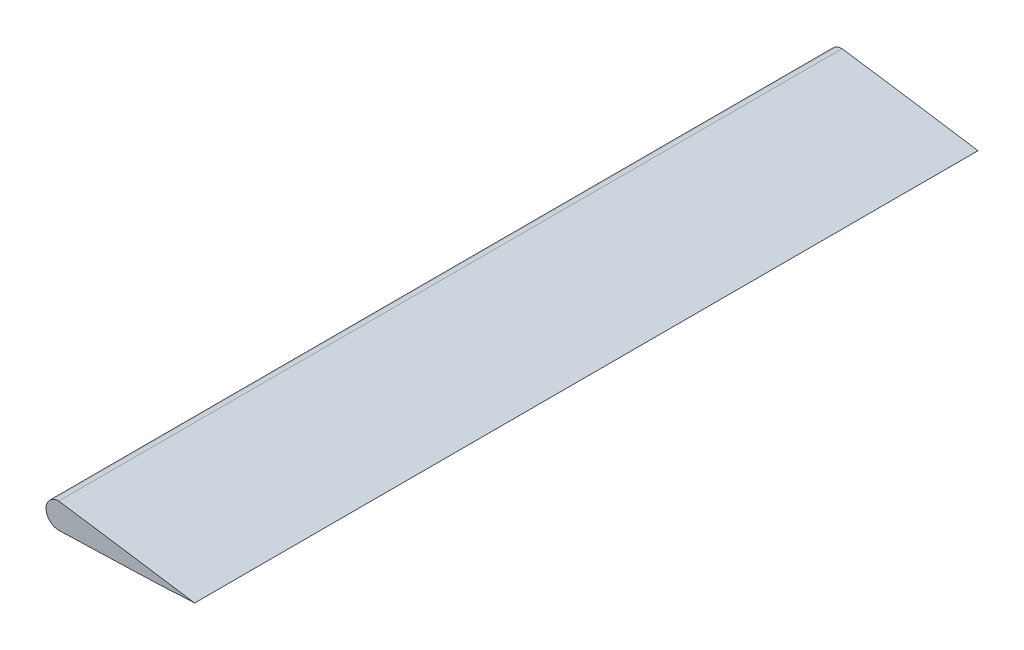
ISO-10303-21;
HEADER;
FILE_DESCRIPTION(('STEP AP214'),'2;1');
FILE_NAME('part.step','',(''),(''),'','','');
FILE_SCHEMA(('AUTOMOTIVE_DESIGN { 1 0 10303 214 1 1 1 1 }'));
ENDSEC;
DATA;
#1=APPLICATION_CONTEXT('core data for automotive mechanical design processes');
#2=APPLICATION_PROTOCOL_DEFINITION('international standard','automotive_design',2000,#1);
#3=PRODUCT_CONTEXT('',#1,'mechanical');
#4=PRODUCT('Part','Part','',(#3));
#5=PRODUCT_RELATED_PRODUCT_CATEGORY('part','',(#4));
#6=PRODUCT_DEFINITION_FORMATION('','',#4);
#7=PRODUCT_DEFINITION_CONTEXT('part definition',#1,'design');
#8=PRODUCT_DEFINITION('design','',#6,#7);
#9=PRODUCT_DEFINITION_SHAPE('','',#8);
#10=(LENGTH_UNIT() NAMED_UNIT(*) SI_UNIT(.MILLI.,.METRE.));
#11=(NAMED_UNIT(*) PLANE_ANGLE_UNIT() SI_UNIT($,.RADIAN.));
#12=(NAMED_UNIT(*) SI_UNIT($,.STERADIAN.) SOLID_ANGLE_UNIT());
#13=UNCERTAINTY_MEASURE_WITH_UNIT(LENGTH_MEASURE(1.E-05),#10,'distance_accuracy_value','');
#14=(GEOMETRIC_REPRESENTATION_CONTEXT(3) GLOBAL_UNCERTAINTY_ASSIGNED_CONTEXT((#13)) GLOBAL_UNIT_ASSIGNED_CONTEXT((#10,
#11,#12)) REPRESENTATION_CONTEXT('',''));
#15=CARTESIAN_POINT('',(0.,0.,0.));
#16=DIRECTION('',(0.,0.,1.));
#17=DIRECTION('',(1.,0.,0.));
#18=AXIS2_PLACEMENT_3D('',#15,#16,#17);
#19=CARTESIAN_POINT('',(114.,0.,196.));
#20=CARTESIAN_POINT('',(114.000070859821,0.00766854362557268,196.));
#21=CARTESIAN_POINT('',(113.170904547856,0.0810981255368522,196.));
#22=CARTESIAN_POINT('',(112.34311059441,0.220293735033325,196.));
#23=CARTESIAN_POINT('',(110.384127786017,0.521461873088204,196.));
#24=CARTESIAN_POINT('',(108.034544222214,0.920009194814472,196.));
#25=CARTESIAN_POINT('',(105.018396273687,1.39618700055359,196.));
#26=CARTESIAN_POINT('',(101.494499518123,1.92711323578578,196.));
#27=CARTESIAN_POINT('',(97.4630272770568,2.52916023938048,196.));
#28=CARTESIAN_POINT('',(92.9940966190191,3.19549681056723,196.));
#29=CARTESIAN_POINT('',(88.1458246905997,3.91353735404522,196.));
#30=CARTESIAN_POINT('',(82.9876192567829,4.67422626207633,196.));
#31=CARTESIAN_POINT('',(77.5889581931363,5.45653841294997,196.));
#32=CARTESIAN_POINT('',(72.0235037444033,6.24484376529578,196.));
#33=CARTESIAN_POINT('',(66.3660404890164,7.01604068367912,196.));
#34=CARTESIAN_POINT('',(60.6906133648769,7.74103002331365,196.));
#35=CARTESIAN_POINT('',(55.0652439984616,8.38605052235087,196.));
#36=CARTESIAN_POINT('',(49.5409891839823,8.89710631001019,196.));
#37=CARTESIAN_POINT('',(44.1567266750541,9.23922641643684,196.));
#38=CARTESIAN_POINT('',(38.9434741526294,9.39512251384328,196.));
#39=CARTESIAN_POINT('',(33.9296675859567,9.35754726095181,196.));
#40=CARTESIAN_POINT('',(29.1402657127287,9.12424085911826,196.));
#41=CARTESIAN_POINT('',(24.60195339589,8.70968702260531,196.));
#42=CARTESIAN_POINT('',(20.3452879969009,8.14942150394286,196.));
#43=CARTESIAN_POINT('',(16.4081346135831,7.46749811130393,196.));
#44=CARTESIAN_POINT('',(12.8301286925856,6.68207211755834,196.));
#45=CARTESIAN_POINT('',(9.64495047873192,5.81310579090178,196.));
#46=CARTESIAN_POINT('',(6.88365371875928,4.87939196932108,196.));
#47=CARTESIAN_POINT('',(4.56368832373312,3.90371578799507,196.));
#48=CARTESIAN_POINT('',(2.71565846861156,2.91320915028181,196.));
#49=CARTESIAN_POINT('',(1.31010258829781,1.93108358789891,196.));
#50=CARTESIAN_POINT('',(0.451729591385324,1.01684875476233,196.));
#51=CARTESIAN_POINT('',(-0.139959670125095,0.142353288741523,196.));
#52=CARTESIAN_POINT('',(0.285785447383265,-0.772403391199949,196.));
#53=CARTESIAN_POINT('',(1.38836625184377,-1.20240945126493,196.));
#54=CARTESIAN_POINT('',(2.91787872153005,-1.70911324124806,196.));
#55=CARTESIAN_POINT('',(5.07627412351198,-2.0733199406355,196.));
#56=CARTESIAN_POINT('',(7.78011221794197,-2.38060266272154,196.));
#57=CARTESIAN_POINT('',(11.0432208788705,-2.59332330232189,196.));
#58=CARTESIAN_POINT('',(14.8282054883316,-2.73006627630052,196.));
#59=CARTESIAN_POINT('',(19.1039540045735,-2.78928483018108,196.));
#60=CARTESIAN_POINT('',(23.8261586523697,-2.78396117052987,196.));
#61=CARTESIAN_POINT('',(28.9449289469638,-2.72270602541656,196.));
#62=CARTESIAN_POINT('',(34.4040131617173,-2.61577838533926,196.));
#63=CARTESIAN_POINT('',(40.1411905530158,-2.47293880115506,196.));
#64=CARTESIAN_POINT('',(46.0896285162779,-2.30467213670795,196.));
#65=CARTESIAN_POINT('',(52.1790444824759,-2.11960086136519,196.));
#66=CARTESIAN_POINT('',(58.3361387996037,-1.92617136535002,196.));
#67=CARTESIAN_POINT('',(64.4871429732049,-1.72910512357721,196.));
#68=CARTESIAN_POINT('',(70.5576084344389,-1.53454296847614,196.));
#69=CARTESIAN_POINT('',(76.4738253903632,-1.34730719526789,196.));
#70=CARTESIAN_POINT('',(82.16358417527,-1.1689243914358,196.));
#71=CARTESIAN_POINT('',(87.5572320181703,-1.00199725541701,196.));
#72=CARTESIAN_POINT('',(92.5887604772492,-0.848416164144451,196.));
#73=CARTESIAN_POINT('',(97.1946438390033,-0.705344580822206,196.));
#74=CARTESIAN_POINT('',(101.321436256403,-0.575266297025637,196.));
#75=CARTESIAN_POINT('',(104.908193417367,-0.447130761495933,196.));
#76=CARTESIAN_POINT('',(107.966500672709,-0.30528690318335,196.));
#77=CARTESIAN_POINT('',(110.345887679848,-0.151439695193536,196.));
#78=CARTESIAN_POINT('',(112.326393475558,-0.0523339673918284,196.));
#79=CARTESIAN_POINT('',(113.163828046821,0.00580611824479458,196.));
#80=CARTESIAN_POINT('',(113.999928769643,-0.00770864351317723,196.));
#81=CARTESIAN_POINT('',(114.,0.,196.));
#82=B_SPLINE_CURVE_WITH_KNOTS('',3,(#19,#20,#21,#22,#23,#24,#25,#26,#27,#28,#29,#30,#31,#32,#33,
#34,#35,#36,#37,#38,#39,#40,#41,#42,#43,#44,#45,#46,#47,#48,#49,#50,#51,#52,#53,#54,#55,#56,#57,
#58,#59,#60,#61,#62,#63,#64,#65,#66,#67,#68,#69,#70,#71,#72,#73,#74,#75,#76,#77,#78,#79,#80,
#81),.UNSPECIFIED.,.T.,.F.,(4,1,1,1,1,1,1,1,1,1,1,1,1,1,1,1,1,1,1,1,1,1,1,1,1,1,1,1,1,1,1,1,1,1,
1,1,1,1,1,1,1,1,1,1,1,1,1,1,1,1,1,1,1,1,1,1,1,1,1,1,4),(0.,0.00170908920432188,
0.00670554395834666,0.0146794477060708,0.0253204149867995,0.0384340234544279,0.053918398525984,
0.0715926528382591,0.0912014853704253,0.11246013052115,0.135078967243569,0.158744656958386,
0.183124582053236,0.207893528230082,0.232708753853741,0.25724049170497,0.281238655619406,
0.304567766838525,0.327117535526956,0.348787275883724,0.369501744493318,0.389214394849973,
0.407804724304426,0.425103938623445,0.440959864666095,0.455241691433255,0.467847759970572,
0.478704669715576,0.487773858261958,0.495055890126516,0.500590365608463,0.50444682113243,
0.507433308065567,0.512166488500185,0.519162613551229,0.528542738633831,0.540327661881314,
0.554464688444683,0.570868441781877,0.58939412051066,0.609852153771201,0.632039414655675,
0.655706347352303,0.680582456314281,0.706381738287305,0.732793305607452,0.759501296409664,
0.786180233853823,0.812514455590519,0.838178612616079,0.862857511958665,0.886255641595348,
0.908082561553005,0.92806289298861,0.945960634244272,0.96153140512853,0.974665069039819,
0.985301353427563,0.993278046328694,0.998281973729092,1.),.UNSPECIFIED.);
#83=DIRECTION('',(0.,0.,-1.));
#84=VECTOR('',#83,1.);
#85=SURFACE_OF_LINEAR_EXTRUSION('',#82,#84);
#86=CARTESIAN_POINT('',(114.,0.,0.));
#87=CARTESIAN_POINT('',(114.000070859821,0.00766854362557268,0.));
#88=CARTESIAN_POINT('',(113.170904547856,0.0810981255368522,0.));
#89=CARTESIAN_POINT('',(112.34311059441,0.220293735033325,0.));
#90=CARTESIAN_POINT('',(110.384127786017,0.521461873088204,0.));
#91=CARTESIAN_POINT('',(108.034544222214,0.920009194814472,0.));
#92=CARTESIAN_POINT('',(105.018396273687,1.39618700055359,0.));
#93=CARTESIAN_POINT('',(101.494499518123,1.92711323578578,0.));
#94=CARTESIAN_POINT('',(97.4630272770568,2.52916023938048,0.));
#95=CARTESIAN_POINT('',(92.9940966190191,3.19549681056723,0.));
#96=CARTESIAN_POINT('',(88.1458246905997,3.91353735404522,0.));
#97=CARTESIAN_POINT('',(82.9876192567829,4.67422626207633,0.));
#98=CARTESIAN_POINT('',(77.5889581931363,5.45653841294997,0.));
#99=CARTESIAN_POINT('',(72.0235037444033,6.24484376529578,0.));
#100=CARTESIAN_POINT('',(66.3660404890164,7.01604068367912,0.));
#101=CARTESIAN_POINT('',(60.6906133648769,7.74103002331365,0.));
#102=CARTESIAN_POINT('',(55.0652439984616,8.38605052235087,0.));
#103=CARTESIAN_POINT('',(49.5409891839823,8.89710631001019,0.));
#104=CARTESIAN_POINT('',(44.1567266750541,9.23922641643684,0.));
#105=CARTESIAN_POINT('',(38.9434741526294,9.39512251384328,0.));
#106=CARTESIAN_POINT('',(33.9296675859567,9.35754726095181,0.));
#107=CARTESIAN_POINT('',(29.1402657127287,9.12424085911826,0.));
#108=CARTESIAN_POINT('',(24.60195339589,8.70968702260531,0.));
#109=CARTESIAN_POINT('',(20.3452879969009,8.14942150394286,0.));
#110=CARTESIAN_POINT('',(16.4081346135831,7.46749811130393,0.));
#111=CARTESIAN_POINT('',(12.8301286925856,6.68207211755834,0.));
#112=CARTESIAN_POINT('',(9.64495047873192,5.81310579090178,0.));
#113=CARTESIAN_POINT('',(6.88365371875928,4.87939196932108,0.));
#114=CARTESIAN_POINT('',(4.56368832373312,3.90371578799507,0.));
#115=CARTESIAN_POINT('',(2.71565846861156,2.91320915028181,0.));
#116=CARTESIAN_POINT('',(1.31010258829781,1.93108358789891,0.));
#117=CARTESIAN_POINT('',(0.451729591385324,1.01684875476233,0.));
#118=CARTESIAN_POINT('',(-0.139959670125095,0.142353288741523,0.));
#119=CARTESIAN_POINT('',(0.285785447383265,-0.772403391199949,0.));
#120=CARTESIAN_POINT('',(1.38836625184377,-1.20240945126493,0.));
#121=CARTESIAN_POINT('',(2.91787872153005,-1.70911324124806,0.));
#122=CARTESIAN_POINT('',(5.07627412351198,-2.0733199406355,0.));
#123=CARTESIAN_POINT('',(7.78011221794197,-2.38060266272154,0.));
#124=CARTESIAN_POINT('',(11.0432208788705,-2.59332330232189,0.));
#125=CARTESIAN_POINT('',(14.8282054883316,-2.73006627630052,0.));
#126=CARTESIAN_POINT('',(19.1039540045735,-2.78928483018108,0.));
#127=CARTESIAN_POINT('',(23.8261586523697,-2.78396117052987,0.));
#128=CARTESIAN_POINT('',(28.9449289469638,-2.72270602541656,0.));
#129=CARTESIAN_POINT('',(34.4040131617173,-2.61577838533926,0.));
#130=CARTESIAN_POINT('',(40.1411905530158,-2.47293880115506,0.));
#131=CARTESIAN_POINT('',(46.0896285162779,-2.30467213670795,0.));
#132=CARTESIAN_POINT('',(52.1790444824759,-2.11960086136519,0.));
#133=CARTESIAN_POINT('',(58.3361387996037,-1.92617136535002,0.));
#134=CARTESIAN_POINT('',(64.4871429732049,-1.72910512357721,0.));
#135=CARTESIAN_POINT('',(70.5576084344389,-1.53454296847614,0.));
#136=CARTESIAN_POINT('',(76.4738253903632,-1.34730719526789,0.));
#137=CARTESIAN_POINT('',(82.16358417527,-1.1689243914358,0.));
#138=CARTESIAN_POINT('',(87.5572320181703,-1.00199725541701,0.));
#139=CARTESIAN_POINT('',(92.5887604772492,-0.848416164144451,0.));
#140=CARTESIAN_POINT('',(97.1946438390033,-0.705344580822206,0.));
#141=CARTESIAN_POINT('',(101.321436256403,-0.575266297025637,0.));
#142=CARTESIAN_POINT('',(104.908193417367,-0.447130761495933,0.));
#143=CARTESIAN_POINT('',(107.966500672709,-0.30528690318335,0.));
#144=CARTESIAN_POINT('',(110.345887679848,-0.151439695193536,0.));
#145=CARTESIAN_POINT('',(112.326393475558,-0.0523339673918284,0.));
#146=CARTESIAN_POINT('',(113.163828046821,0.00580611824479458,0.));
#147=CARTESIAN_POINT('',(113.999928769643,-0.00770864351317723,0.));
#148=CARTESIAN_POINT('',(114.,0.,0.));
#149=B_SPLINE_CURVE_WITH_KNOTS('',3,(#86,#87,#88,#89,#90,#91,#92,#93,#94,#95,#96,#97,#98,#99,
#100,#101,#102,#103,#104,#105,#106,#107,#108,#109,#110,#111,#112,#113,#114,#115,#116,#117,#118,
#119,#120,#121,#122,#123,#124,#125,#126,#127,#128,#129,#130,#131,#132,#133,#134,#135,#136,#137,
#138,#139,#140,#141,#142,#143,#144,#145,#146,#147,#148),.UNSPECIFIED.,.T.,.F.,(4,1,1,1,1,1,1,1,
1,1,1,1,1,1,1,1,1,1,1,1,1,1,1,1,1,1,1,1,1,1,1,1,1,1,1,1,1,1,1,1,1,1,1,1,1,1,1,1,1,1,1,1,1,1,1,1,
1,1,1,1,4),(0.,0.00170908920432188,0.00670554395834666,0.0146794477060708,0.0253204149867995,
0.0384340234544279,0.053918398525984,0.0715926528382591,0.0912014853704253,0.11246013052115,
0.135078967243569,0.158744656958386,0.183124582053236,0.207893528230082,0.232708753853741,
0.25724049170497,0.281238655619406,0.304567766838525,0.327117535526956,0.348787275883724,
0.369501744493318,0.389214394849973,0.407804724304426,0.425103938623445,0.440959864666095,
0.455241691433255,0.467847759970572,0.478704669715576,0.487773858261958,0.495055890126516,
0.500590365608463,0.50444682113243,0.507433308065567,0.512166488500185,0.519162613551229,
0.528542738633831,0.540327661881314,0.554464688444683,0.570868441781877,0.58939412051066,
0.609852153771201,0.632039414655675,0.655706347352303,0.680582456314281,0.706381738287305,
0.732793305607452,0.759501296409664,0.786180233853823,0.812514455590519,0.838178612616079,
0.862857511958665,0.886255641595348,0.908082561553005,0.92806289298861,0.945960634244272,
0.96153140512853,0.974665069039819,0.985301353427563,0.993278046328694,0.998281973729092,1.),.UNSPECIFIED.);
#150=CARTESIAN_POINT('',(80.,-1.2368600294278,0.));
#151=VERTEX_POINT('',#150);
#152=CARTESIAN_POINT('',(80.,5.10643726970797,0.));
#153=VERTEX_POINT('',#152);
#154=EDGE_CURVE('E79',#151,#153,#149,.T.);
#155=ORIENTED_EDGE('',*,*,#154,.T.);
#156=DIRECTION('',(0.,0.,-1.));
#157=VECTOR('',#156,1.);
#158=CARTESIAN_POINT('',(80.,5.10643726970797,196.));
#159=LINE('',#158,#157);
#160=CARTESIAN_POINT('',(80.,5.10643726970797,196.));
#161=VERTEX_POINT('',#160);
#162=EDGE_CURVE('E11',#161,#153,#159,.T.);
#163=ORIENTED_EDGE('',*,*,#162,.F.);
#164=CARTESIAN_POINT('',(80.,-1.2368600294278,196.));
#165=VERTEX_POINT('',#164);
#166=EDGE_CURVE('E78',#165,#161,#82,.T.);
#167=ORIENTED_EDGE('',*,*,#166,.F.);
#168=DIRECTION('',(0.,0.,-1.));
#169=VECTOR('',#168,1.);
#170=CARTESIAN_POINT('',(80.,-1.2368600294278,196.));
#171=LINE('',#170,#169);
#172=EDGE_CURVE('E55',#165,#151,#171,.T.);
#173=ORIENTED_EDGE('',*,*,#172,.T.);
#174=EDGE_LOOP('',(#155,#163,#167,#173));
#175=FACE_BOUND('',#174,.T.);
#176=ADVANCED_FACE('F45',(#175),#85,.F.);
#177=CARTESIAN_POINT('',(80.,1.93478862014009,196.));
#178=DIRECTION('',(0.,0.,-1.));
#179=DIRECTION('',(-1.,0.,0.));
#180=AXIS2_PLACEMENT_3D('',#177,#178,#179);
#181=CYLINDRICAL_SURFACE('',#180,3.17164864956788);
#182=CARTESIAN_POINT('',(80.,1.93478862014009,0.));
#183=DIRECTION('',(0.,0.,1.));
#184=DIRECTION('',(1.,0.,0.));
#185=AXIS2_PLACEMENT_3D('',#182,#183,#184);
#186=CIRCLE('',#185,3.17164864956788);
#187=EDGE_CURVE('E70',#153,#151,#186,.T.);
#188=ORIENTED_EDGE('',*,*,#187,.T.);
#189=ORIENTED_EDGE('',*,*,#172,.F.);
#190=CARTESIAN_POINT('',(80.,1.93478862014009,196.));
#191=DIRECTION('',(0.,0.,1.));
#192=DIRECTION('',(1.,0.,0.));
#193=AXIS2_PLACEMENT_3D('',#190,#191,#192);
#194=CIRCLE('',#193,3.17164864956788);
#195=EDGE_CURVE('E62',#161,#165,#194,.T.);
#196=ORIENTED_EDGE('',*,*,#195,.F.);
#197=ORIENTED_EDGE('',*,*,#162,.T.);
#198=EDGE_LOOP('',(#188,#189,#196,#197));
#199=FACE_BOUND('',#198,.T.);
#200=ADVANCED_FACE('F73',(#199),#181,.T.);
#201=CARTESIAN_POINT('',(0.465113194344468,0.985139367464416,196.));
#202=DIRECTION('',(0.,0.,-1.));
#203=DIRECTION('',(-1.,0.,0.));
#204=AXIS2_PLACEMENT_3D('',#201,#202,#203);
#205=PLANE('',#204);
#206=ORIENTED_EDGE('',*,*,#166,.T.);
#207=ORIENTED_EDGE('',*,*,#195,.T.);
#208=EDGE_LOOP('',(#206,#207));
#209=FACE_BOUND('',#208,.T.);
#210=ADVANCED_FACE('F100',(#209),#205,.F.);
#211=CARTESIAN_POINT('',(0.465113194344468,0.985139367464416,0.));
#212=DIRECTION('',(0.,0.,-1.));
#213=DIRECTION('',(-1.,0.,0.));
#214=AXIS2_PLACEMENT_3D('',#211,#212,#213);
#215=PLANE('',#214);
#216=ORIENTED_EDGE('',*,*,#154,.F.);
#217=ORIENTED_EDGE('',*,*,#187,.F.);
#218=EDGE_LOOP('',(#216,#217));
#219=FACE_BOUND('',#218,.T.);
#220=ADVANCED_FACE('F83',(#219),#215,.T.);
#221=CLOSED_SHELL('',(#176,#200,#210,#220));
#222=MANIFOLD_SOLID_BREP('B2',#221);
#223=ADVANCED_BREP_SHAPE_REPRESENTATION('',(#18,#222),#14);
#224=SHAPE_DEFINITION_REPRESENTATION(#9,#223);
ENDSEC;
END-ISO-10303-21;
